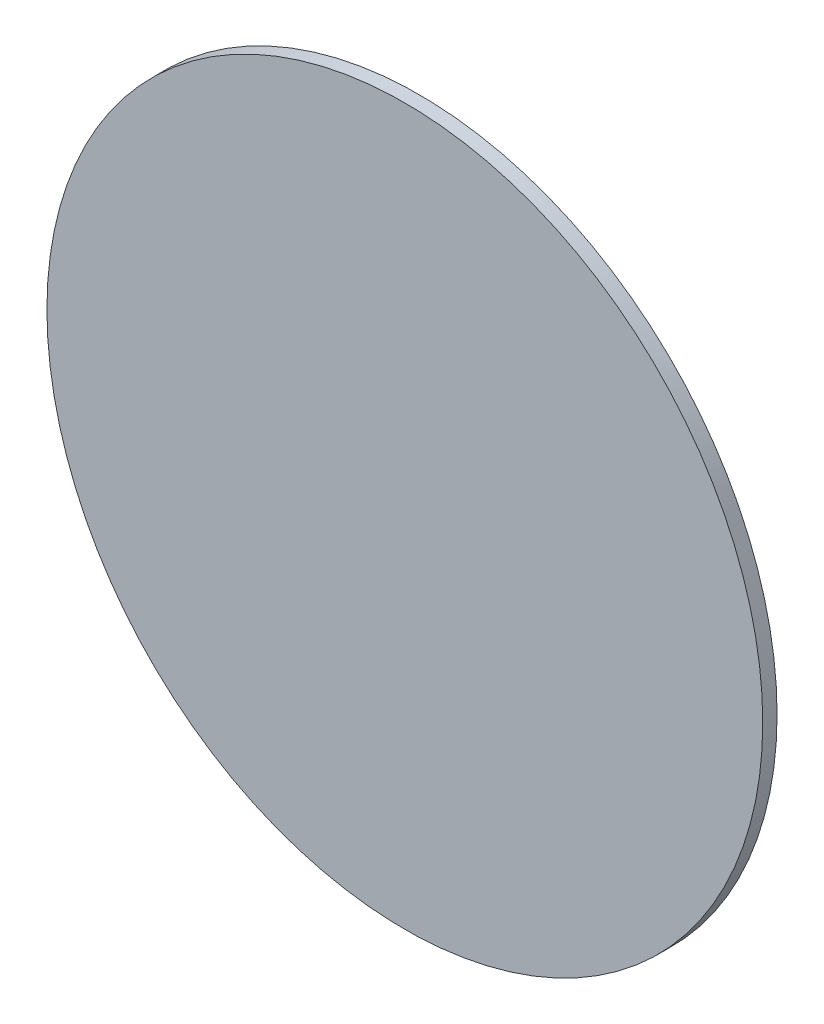
ISO-10303-21;
HEADER;
FILE_DESCRIPTION(('STEP AP214'),'2;1');
FILE_NAME('part.step','',(''),(''),'','','');
FILE_SCHEMA(('AUTOMOTIVE_DESIGN { 1 0 10303 214 1 1 1 1 }'));
ENDSEC;
DATA;
#1=APPLICATION_CONTEXT('core data for automotive mechanical design processes');
#2=APPLICATION_PROTOCOL_DEFINITION('international standard','automotive_design',2000,#1);
#3=PRODUCT_CONTEXT('',#1,'mechanical');
#4=PRODUCT('Part','Part','',(#3));
#5=PRODUCT_RELATED_PRODUCT_CATEGORY('part','',(#4));
#6=PRODUCT_DEFINITION_FORMATION('','',#4);
#7=PRODUCT_DEFINITION_CONTEXT('part definition',#1,'design');
#8=PRODUCT_DEFINITION('design','',#6,#7);
#9=PRODUCT_DEFINITION_SHAPE('','',#8);
#10=(LENGTH_UNIT() NAMED_UNIT(*) SI_UNIT(.MILLI.,.METRE.));
#11=(NAMED_UNIT(*) PLANE_ANGLE_UNIT() SI_UNIT($,.RADIAN.));
#12=(NAMED_UNIT(*) SI_UNIT($,.STERADIAN.) SOLID_ANGLE_UNIT());
#13=UNCERTAINTY_MEASURE_WITH_UNIT(LENGTH_MEASURE(1.E-05),#10,'distance_accuracy_value','');
#14=(GEOMETRIC_REPRESENTATION_CONTEXT(3) GLOBAL_UNCERTAINTY_ASSIGNED_CONTEXT((#13)) GLOBAL_UNIT_ASSIGNED_CONTEXT((#10,
#11,#12)) REPRESENTATION_CONTEXT('',''));
#15=CARTESIAN_POINT('',(0.,0.,0.));
#16=DIRECTION('',(0.,0.,1.));
#17=DIRECTION('',(1.,0.,0.));
#18=AXIS2_PLACEMENT_3D('',#15,#16,#17);
#19=CARTESIAN_POINT('',(0.,0.,6.));
#20=DIRECTION('',(0.,0.,-1.));
#21=DIRECTION('',(-1.,0.,0.));
#22=AXIS2_PLACEMENT_3D('',#19,#20,#21);
#23=CYLINDRICAL_SURFACE('',#22,11.5);
#24=CARTESIAN_POINT('',(0.,0.,0.));
#25=DIRECTION('',(0.,0.,1.));
#26=DIRECTION('',(1.,0.,0.));
#27=AXIS2_PLACEMENT_3D('',#24,#25,#26);
#28=CIRCLE('',#27,11.5);
#29=CARTESIAN_POINT('',(11.5,0.,0.));
#30=VERTEX_POINT('',#29);
#31=EDGE_CURVE('E46',#30,#30,#28,.T.);
#32=ORIENTED_EDGE('',*,*,#31,.T.);
#33=EDGE_LOOP('',(#32));
#34=FACE_BOUND('',#33,.T.);
#35=CARTESIAN_POINT('',(0.,0.,5.));
#36=DIRECTION('',(0.,0.,1.));
#37=DIRECTION('',(1.,0.,0.));
#38=AXIS2_PLACEMENT_3D('',#35,#36,#37);
#39=CIRCLE('',#38,11.5);
#40=CARTESIAN_POINT('',(11.5,0.,5.));
#41=VERTEX_POINT('',#40);
#42=EDGE_CURVE('E10',#41,#41,#39,.T.);
#43=ORIENTED_EDGE('',*,*,#42,.F.);
#44=EDGE_LOOP('',(#43));
#45=FACE_BOUND('',#44,.T.);
#46=ADVANCED_FACE('F40',(#34,#45),#23,.T.);
#47=CARTESIAN_POINT('',(0.,0.,0.));
#48=DIRECTION('',(0.,0.,1.));
#49=DIRECTION('',(1.,0.,0.));
#50=AXIS2_PLACEMENT_3D('',#47,#48,#49);
#51=PLANE('',#50);
#52=ORIENTED_EDGE('',*,*,#31,.F.);
#53=EDGE_LOOP('',(#52));
#54=FACE_BOUND('',#53,.T.);
#55=ADVANCED_FACE('F65',(#54),#51,.F.);
#56=CARTESIAN_POINT('',(0.,0.,5.));
#57=DIRECTION('',(0.,0.,1.));
#58=DIRECTION('',(1.,0.,0.));
#59=AXIS2_PLACEMENT_3D('',#56,#57,#58);
#60=CYLINDRICAL_SURFACE('',#59,25.);
#61=CARTESIAN_POINT('',(0.,0.,5.));
#62=DIRECTION('',(0.,0.,1.));
#63=DIRECTION('',(1.,0.,0.));
#64=AXIS2_PLACEMENT_3D('',#61,#62,#63);
#65=CIRCLE('',#64,25.);
#66=CARTESIAN_POINT('',(25.,0.,5.));
#67=VERTEX_POINT('',#66);
#68=EDGE_CURVE('E50',#67,#67,#65,.T.);
#69=ORIENTED_EDGE('',*,*,#68,.T.);
#70=EDGE_LOOP('',(#69));
#71=FACE_BOUND('',#70,.T.);
#72=CARTESIAN_POINT('',(0.,0.,6.));
#73=DIRECTION('',(0.,0.,1.));
#74=DIRECTION('',(1.,0.,0.));
#75=AXIS2_PLACEMENT_3D('',#72,#73,#74);
#76=CIRCLE('',#75,25.);
#77=CARTESIAN_POINT('',(25.,0.,6.));
#78=VERTEX_POINT('',#77);
#79=EDGE_CURVE('E54',#78,#78,#76,.T.);
#80=ORIENTED_EDGE('',*,*,#79,.F.);
#81=EDGE_LOOP('',(#80));
#82=FACE_BOUND('',#81,.T.);
#83=ADVANCED_FACE('F62',(#71,#82),#60,.T.);
#84=CARTESIAN_POINT('',(0.,0.,5.));
#85=DIRECTION('',(0.,0.,1.));
#86=DIRECTION('',(1.,0.,0.));
#87=AXIS2_PLACEMENT_3D('',#84,#85,#86);
#88=PLANE('',#87);
#89=ORIENTED_EDGE('',*,*,#42,.T.);
#90=EDGE_LOOP('',(#89));
#91=FACE_BOUND('',#90,.T.);
#92=ORIENTED_EDGE('',*,*,#68,.F.);
#93=EDGE_LOOP('',(#92));
#94=FACE_BOUND('',#93,.T.);
#95=ADVANCED_FACE('F64',(#91,#94),#88,.F.);
#96=CARTESIAN_POINT('',(0.,0.,6.));
#97=DIRECTION('',(0.,0.,1.));
#98=DIRECTION('',(1.,0.,0.));
#99=AXIS2_PLACEMENT_3D('',#96,#97,#98);
#100=PLANE('',#99);
#101=ORIENTED_EDGE('',*,*,#79,.T.);
#102=EDGE_LOOP('',(#101));
#103=FACE_BOUND('',#102,.T.);
#104=ADVANCED_FACE('F60',(#103),#100,.T.);
#105=CLOSED_SHELL('',(#46,#55,#83,#95,#104));
#106=MANIFOLD_SOLID_BREP('B2',#105);
#107=ADVANCED_BREP_SHAPE_REPRESENTATION('',(#18,#106),#14);
#108=SHAPE_DEFINITION_REPRESENTATION(#9,#107);
ENDSEC;
END-ISO-10303-21;
